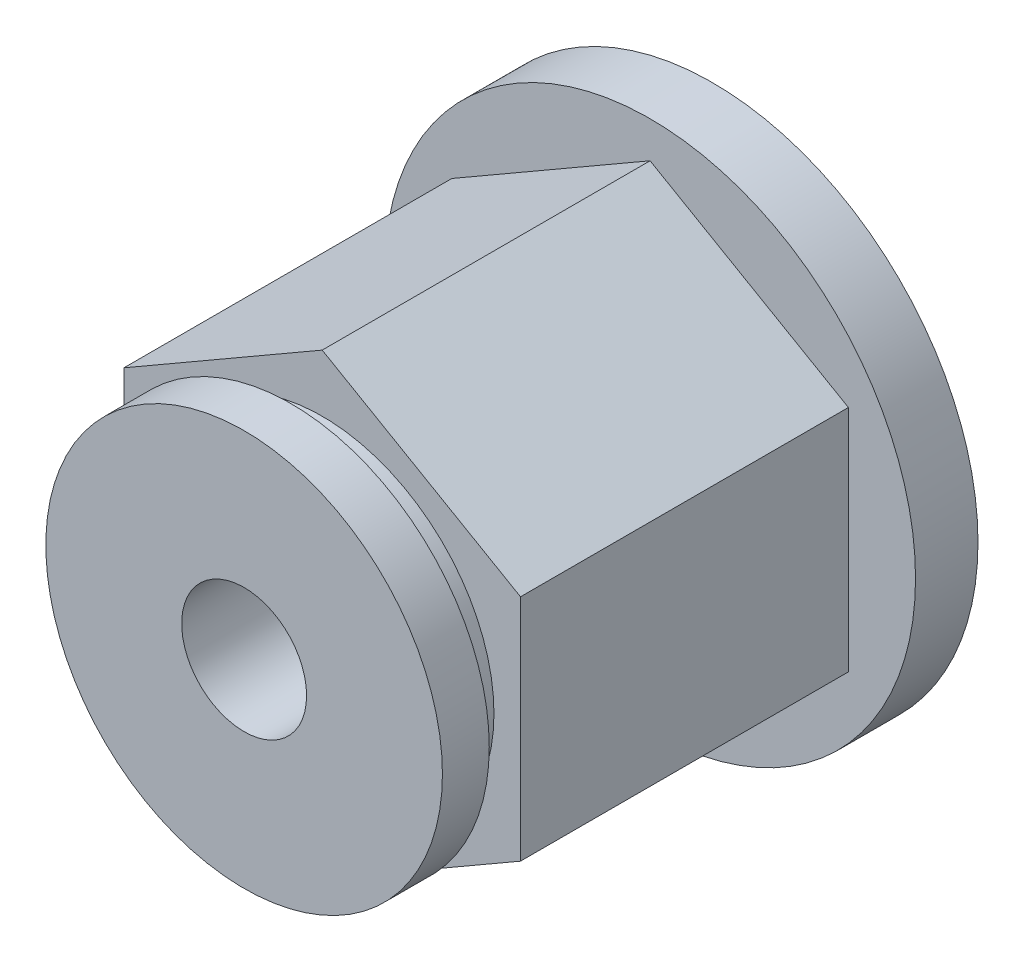
ISO-10303-21;
HEADER;
FILE_DESCRIPTION(('STEP AP214'),'2;1');
FILE_NAME('part.step','',(''),(''),'','','');
FILE_SCHEMA(('AUTOMOTIVE_DESIGN { 1 0 10303 214 1 1 1 1 }'));
ENDSEC;
DATA;
#1=APPLICATION_CONTEXT('core data for automotive mechanical design processes');
#2=APPLICATION_PROTOCOL_DEFINITION('international standard','automotive_design',2000,#1);
#3=PRODUCT_CONTEXT('',#1,'mechanical');
#4=PRODUCT('Part','Part','',(#3));
#5=PRODUCT_RELATED_PRODUCT_CATEGORY('part','',(#4));
#6=PRODUCT_DEFINITION_FORMATION('','',#4);
#7=PRODUCT_DEFINITION_CONTEXT('part definition',#1,'design');
#8=PRODUCT_DEFINITION('design','',#6,#7);
#9=PRODUCT_DEFINITION_SHAPE('','',#8);
#10=(LENGTH_UNIT() NAMED_UNIT(*) SI_UNIT(.MILLI.,.METRE.));
#11=(NAMED_UNIT(*) PLANE_ANGLE_UNIT() SI_UNIT($,.RADIAN.));
#12=(NAMED_UNIT(*) SI_UNIT($,.STERADIAN.) SOLID_ANGLE_UNIT());
#13=UNCERTAINTY_MEASURE_WITH_UNIT(LENGTH_MEASURE(1.E-05),#10,'distance_accuracy_value','');
#14=(GEOMETRIC_REPRESENTATION_CONTEXT(3) GLOBAL_UNCERTAINTY_ASSIGNED_CONTEXT((#13)) GLOBAL_UNIT_ASSIGNED_CONTEXT((#10,
#11,#12)) REPRESENTATION_CONTEXT('',''));
#15=CARTESIAN_POINT('',(0.,0.,0.));
#16=DIRECTION('',(0.,0.,1.));
#17=DIRECTION('',(1.,0.,0.));
#18=AXIS2_PLACEMENT_3D('',#15,#16,#17);
#19=CARTESIAN_POINT('',(6.35,-3.66617420935413,12.5));
#20=DIRECTION('',(0.,0.,1.));
#21=DIRECTION('',(1.,0.,0.));
#22=AXIS2_PLACEMENT_3D('',#19,#20,#21);
#23=PLANE('',#22);
#24=DIRECTION('',(0.866025403784439,0.5,0.));
#25=VECTOR('',#24,1.);
#26=CARTESIAN_POINT('',(0.,-7.33234841870825,12.5));
#27=LINE('',#26,#25);
#28=CARTESIAN_POINT('',(0.,-7.33234841870825,12.5));
#29=VERTEX_POINT('',#28);
#30=CARTESIAN_POINT('',(6.35,-3.66617420935413,12.5));
#31=VERTEX_POINT('',#30);
#32=EDGE_CURVE('E128',#29,#31,#27,.T.);
#33=ORIENTED_EDGE('',*,*,#32,.T.);
#34=DIRECTION('',(0.,1.,0.));
#35=VECTOR('',#34,1.);
#36=CARTESIAN_POINT('',(6.35,-3.66617420935413,12.5));
#37=LINE('',#36,#35);
#38=CARTESIAN_POINT('',(6.35,3.66617420935412,12.5));
#39=VERTEX_POINT('',#38);
#40=EDGE_CURVE('E83',#31,#39,#37,.T.);
#41=ORIENTED_EDGE('',*,*,#40,.T.);
#42=DIRECTION('',(-0.866025403784439,0.5,0.));
#43=VECTOR('',#42,1.);
#44=CARTESIAN_POINT('',(6.35,3.66617420935412,12.5));
#45=LINE('',#44,#43);
#46=CARTESIAN_POINT('',(0.,7.33234841870825,12.5));
#47=VERTEX_POINT('',#46);
#48=EDGE_CURVE('E96',#39,#47,#45,.T.);
#49=ORIENTED_EDGE('',*,*,#48,.T.);
#50=DIRECTION('',(-0.866025403784439,-0.5,0.));
#51=VECTOR('',#50,1.);
#52=CARTESIAN_POINT('',(0.,7.33234841870825,12.5));
#53=LINE('',#52,#51);
#54=CARTESIAN_POINT('',(-6.35,3.66617420935412,12.5));
#55=VERTEX_POINT('',#54);
#56=EDGE_CURVE('E90',#47,#55,#53,.T.);
#57=ORIENTED_EDGE('',*,*,#56,.T.);
#58=DIRECTION('',(0.,-1.,0.));
#59=VECTOR('',#58,1.);
#60=CARTESIAN_POINT('',(-6.35,3.66617420935412,12.5));
#61=LINE('',#60,#59);
#62=CARTESIAN_POINT('',(-6.35,-3.66617420935412,12.5));
#63=VERTEX_POINT('',#62);
#64=EDGE_CURVE('E94',#55,#63,#61,.T.);
#65=ORIENTED_EDGE('',*,*,#64,.T.);
#66=DIRECTION('',(0.866025403784438,-0.5,0.));
#67=VECTOR('',#66,1.);
#68=CARTESIAN_POINT('',(-6.35,-3.66617420935412,12.5));
#69=LINE('',#68,#67);
#70=EDGE_CURVE('E55',#63,#29,#69,.T.);
#71=ORIENTED_EDGE('',*,*,#70,.T.);
#72=EDGE_LOOP('',(#33,#41,#49,#57,#65,#71));
#73=FACE_BOUND('',#72,.T.);
#74=CARTESIAN_POINT('',(0.,0.,12.5));
#75=DIRECTION('',(0.,0.,1.));
#76=DIRECTION('',(1.,0.,0.));
#77=AXIS2_PLACEMENT_3D('',#74,#75,#76);
#78=CIRCLE('',#77,5.5);
#79=CARTESIAN_POINT('',(5.5,0.,12.5));
#80=VERTEX_POINT('',#79);
#81=EDGE_CURVE('E188',#80,#80,#78,.T.);
#82=ORIENTED_EDGE('',*,*,#81,.F.);
#83=EDGE_LOOP('',(#82));
#84=FACE_BOUND('',#83,.T.);
#85=ADVANCED_FACE('F32',(#73,#84),#23,.T.);
#86=CARTESIAN_POINT('',(0.,0.,2.));
#87=DIRECTION('',(0.,0.,1.));
#88=DIRECTION('',(1.,0.,0.));
#89=AXIS2_PLACEMENT_3D('',#86,#87,#88);
#90=PLANE('',#89);
#91=CARTESIAN_POINT('',(0.,0.,2.));
#92=DIRECTION('',(0.,0.,1.));
#93=DIRECTION('',(1.,0.,0.));
#94=AXIS2_PLACEMENT_3D('',#91,#92,#93);
#95=CIRCLE('',#94,8.5);
#96=CARTESIAN_POINT('',(8.5,0.,2.));
#97=VERTEX_POINT('',#96);
#98=EDGE_CURVE('E11',#97,#97,#95,.T.);
#99=ORIENTED_EDGE('',*,*,#98,.T.);
#100=EDGE_LOOP('',(#99));
#101=FACE_BOUND('',#100,.T.);
#102=DIRECTION('',(0.,1.,0.));
#103=VECTOR('',#102,1.);
#104=CARTESIAN_POINT('',(6.35,-3.66617420935413,2.));
#105=LINE('',#104,#103);
#106=CARTESIAN_POINT('',(6.35,-3.66617420935413,2.));
#107=VERTEX_POINT('',#106);
#108=CARTESIAN_POINT('',(6.35,3.66617420935412,2.));
#109=VERTEX_POINT('',#108);
#110=EDGE_CURVE('E119',#107,#109,#105,.T.);
#111=ORIENTED_EDGE('',*,*,#110,.F.);
#112=DIRECTION('',(0.866025403784439,0.5,0.));
#113=VECTOR('',#112,1.);
#114=CARTESIAN_POINT('',(0.,-7.33234841870825,2.));
#115=LINE('',#114,#113);
#116=CARTESIAN_POINT('',(0.,-7.33234841870825,2.));
#117=VERTEX_POINT('',#116);
#118=EDGE_CURVE('E116',#117,#107,#115,.T.);
#119=ORIENTED_EDGE('',*,*,#118,.F.);
#120=DIRECTION('',(0.866025403784438,-0.5,0.));
#121=VECTOR('',#120,1.);
#122=CARTESIAN_POINT('',(-6.35,-3.66617420935412,2.));
#123=LINE('',#122,#121);
#124=CARTESIAN_POINT('',(-6.35,-3.66617420935412,2.));
#125=VERTEX_POINT('',#124);
#126=EDGE_CURVE('E75',#125,#117,#123,.T.);
#127=ORIENTED_EDGE('',*,*,#126,.F.);
#128=DIRECTION('',(0.,-1.,0.));
#129=VECTOR('',#128,1.);
#130=CARTESIAN_POINT('',(-6.35,3.66617420935412,2.));
#131=LINE('',#130,#129);
#132=CARTESIAN_POINT('',(-6.35,3.66617420935412,2.));
#133=VERTEX_POINT('',#132);
#134=EDGE_CURVE('E125',#133,#125,#131,.T.);
#135=ORIENTED_EDGE('',*,*,#134,.F.);
#136=DIRECTION('',(-0.866025403784439,-0.5,0.));
#137=VECTOR('',#136,1.);
#138=CARTESIAN_POINT('',(0.,7.33234841870825,2.));
#139=LINE('',#138,#137);
#140=CARTESIAN_POINT('',(0.,7.33234841870825,2.));
#141=VERTEX_POINT('',#140);
#142=EDGE_CURVE('E105',#141,#133,#139,.T.);
#143=ORIENTED_EDGE('',*,*,#142,.F.);
#144=DIRECTION('',(-0.866025403784439,0.5,0.));
#145=VECTOR('',#144,1.);
#146=CARTESIAN_POINT('',(6.35,3.66617420935412,2.));
#147=LINE('',#146,#145);
#148=EDGE_CURVE('E122',#109,#141,#147,.T.);
#149=ORIENTED_EDGE('',*,*,#148,.F.);
#150=EDGE_LOOP('',(#111,#119,#127,#135,#143,#149));
#151=FACE_BOUND('',#150,.T.);
#152=ADVANCED_FACE('F152',(#101,#151),#90,.T.);
#153=CARTESIAN_POINT('',(0.,0.,2.));
#154=DIRECTION('',(0.,0.,-1.));
#155=DIRECTION('',(-1.,0.,0.));
#156=AXIS2_PLACEMENT_3D('',#153,#154,#155);
#157=CYLINDRICAL_SURFACE('',#156,8.5);
#158=ORIENTED_EDGE('',*,*,#98,.F.);
#159=EDGE_LOOP('',(#158));
#160=FACE_BOUND('',#159,.T.);
#161=CARTESIAN_POINT('',(0.,0.,0.));
#162=DIRECTION('',(0.,0.,1.));
#163=DIRECTION('',(1.,0.,0.));
#164=AXIS2_PLACEMENT_3D('',#161,#162,#163);
#165=CIRCLE('',#164,8.5);
#166=CARTESIAN_POINT('',(8.5,0.,0.));
#167=VERTEX_POINT('',#166);
#168=EDGE_CURVE('E36',#167,#167,#165,.T.);
#169=ORIENTED_EDGE('',*,*,#168,.T.);
#170=EDGE_LOOP('',(#169));
#171=FACE_BOUND('',#170,.T.);
#172=ADVANCED_FACE('F34',(#160,#171),#157,.T.);
#173=CARTESIAN_POINT('',(0.,0.,0.));
#174=DIRECTION('',(0.,0.,1.));
#175=DIRECTION('',(1.,0.,0.));
#176=AXIS2_PLACEMENT_3D('',#173,#174,#175);
#177=PLANE('',#176);
#178=CARTESIAN_POINT('',(0.,0.,0.));
#179=DIRECTION('',(0.,0.,1.));
#180=DIRECTION('',(1.,0.,0.));
#181=AXIS2_PLACEMENT_3D('',#178,#179,#180);
#182=CIRCLE('',#181,2.);
#183=CARTESIAN_POINT('',(2.,0.,0.));
#184=VERTEX_POINT('',#183);
#185=EDGE_CURVE('E197',#184,#184,#182,.T.);
#186=ORIENTED_EDGE('',*,*,#185,.T.);
#187=EDGE_LOOP('',(#186));
#188=FACE_BOUND('',#187,.T.);
#189=ORIENTED_EDGE('',*,*,#168,.F.);
#190=EDGE_LOOP('',(#189));
#191=FACE_BOUND('',#190,.T.);
#192=ADVANCED_FACE('F141',(#188,#191),#177,.F.);
#193=CARTESIAN_POINT('',(0.,-7.33234841870825,12.5));
#194=DIRECTION('',(-0.5,0.866025403784439,0.));
#195=DIRECTION('',(-0.866025403784439,-0.5,0.));
#196=AXIS2_PLACEMENT_3D('',#193,#194,#195);
#197=PLANE('',#196);
#198=ORIENTED_EDGE('',*,*,#118,.T.);
#199=DIRECTION('',(0.,0.,-1.));
#200=VECTOR('',#199,1.);
#201=CARTESIAN_POINT('',(6.35,-3.66617420935413,12.5));
#202=LINE('',#201,#200);
#203=EDGE_CURVE('E135',#31,#107,#202,.T.);
#204=ORIENTED_EDGE('',*,*,#203,.F.);
#205=ORIENTED_EDGE('',*,*,#32,.F.);
#206=DIRECTION('',(0.,0.,-1.));
#207=VECTOR('',#206,1.);
#208=CARTESIAN_POINT('',(0.,-7.33234841870825,12.5));
#209=LINE('',#208,#207);
#210=EDGE_CURVE('E112',#29,#117,#209,.T.);
#211=ORIENTED_EDGE('',*,*,#210,.T.);
#212=EDGE_LOOP('',(#198,#204,#205,#211));
#213=FACE_BOUND('',#212,.T.);
#214=ADVANCED_FACE('F143',(#213),#197,.F.);
#215=CARTESIAN_POINT('',(6.35,-3.66617420935413,12.5));
#216=DIRECTION('',(-1.,0.,0.));
#217=DIRECTION('',(0.,0.,1.));
#218=AXIS2_PLACEMENT_3D('',#215,#216,#217);
#219=PLANE('',#218);
#220=ORIENTED_EDGE('',*,*,#110,.T.);
#221=DIRECTION('',(0.,0.,-1.));
#222=VECTOR('',#221,1.);
#223=CARTESIAN_POINT('',(6.35,3.66617420935412,12.5));
#224=LINE('',#223,#222);
#225=EDGE_CURVE('E132',#39,#109,#224,.T.);
#226=ORIENTED_EDGE('',*,*,#225,.F.);
#227=ORIENTED_EDGE('',*,*,#40,.F.);
#228=ORIENTED_EDGE('',*,*,#203,.T.);
#229=EDGE_LOOP('',(#220,#226,#227,#228));
#230=FACE_BOUND('',#229,.T.);
#231=ADVANCED_FACE('F149',(#230),#219,.F.);
#232=CARTESIAN_POINT('',(6.35,3.66617420935412,12.5));
#233=DIRECTION('',(-0.5,-0.866025403784439,0.));
#234=DIRECTION('',(0.866025403784439,-0.5,0.));
#235=AXIS2_PLACEMENT_3D('',#232,#233,#234);
#236=PLANE('',#235);
#237=ORIENTED_EDGE('',*,*,#148,.T.);
#238=DIRECTION('',(0.,0.,-1.));
#239=VECTOR('',#238,1.);
#240=CARTESIAN_POINT('',(0.,7.33234841870825,12.5));
#241=LINE('',#240,#239);
#242=EDGE_CURVE('E108',#47,#141,#241,.T.);
#243=ORIENTED_EDGE('',*,*,#242,.F.);
#244=ORIENTED_EDGE('',*,*,#48,.F.);
#245=ORIENTED_EDGE('',*,*,#225,.T.);
#246=EDGE_LOOP('',(#237,#243,#244,#245));
#247=FACE_BOUND('',#246,.T.);
#248=ADVANCED_FACE('F173',(#247),#236,.F.);
#249=CARTESIAN_POINT('',(0.,7.33234841870825,12.5));
#250=DIRECTION('',(0.5,-0.866025403784439,0.));
#251=DIRECTION('',(0.866025403784439,0.5,0.));
#252=AXIS2_PLACEMENT_3D('',#249,#250,#251);
#253=PLANE('',#252);
#254=ORIENTED_EDGE('',*,*,#142,.T.);
#255=DIRECTION('',(0.,0.,-1.));
#256=VECTOR('',#255,1.);
#257=CARTESIAN_POINT('',(-6.35,3.66617420935412,12.5));
#258=LINE('',#257,#256);
#259=EDGE_CURVE('E102',#55,#133,#258,.T.);
#260=ORIENTED_EDGE('',*,*,#259,.F.);
#261=ORIENTED_EDGE('',*,*,#56,.F.);
#262=ORIENTED_EDGE('',*,*,#242,.T.);
#263=EDGE_LOOP('',(#254,#260,#261,#262));
#264=FACE_BOUND('',#263,.T.);
#265=ADVANCED_FACE('F103',(#264),#253,.F.);
#266=CARTESIAN_POINT('',(-6.35,3.66617420935412,12.5));
#267=DIRECTION('',(1.,0.,0.));
#268=DIRECTION('',(0.,0.,-1.));
#269=AXIS2_PLACEMENT_3D('',#266,#267,#268);
#270=PLANE('',#269);
#271=ORIENTED_EDGE('',*,*,#134,.T.);
#272=DIRECTION('',(0.,0.,-1.));
#273=VECTOR('',#272,1.);
#274=CARTESIAN_POINT('',(-6.35,-3.66617420935412,12.5));
#275=LINE('',#274,#273);
#276=EDGE_CURVE('E47',#63,#125,#275,.T.);
#277=ORIENTED_EDGE('',*,*,#276,.F.);
#278=ORIENTED_EDGE('',*,*,#64,.F.);
#279=ORIENTED_EDGE('',*,*,#259,.T.);
#280=EDGE_LOOP('',(#271,#277,#278,#279));
#281=FACE_BOUND('',#280,.T.);
#282=ADVANCED_FACE('F110',(#281),#270,.F.);
#283=CARTESIAN_POINT('',(-6.35,-3.66617420935412,12.5));
#284=DIRECTION('',(0.5,0.866025403784439,0.));
#285=DIRECTION('',(-0.866025403784438,0.5,0.));
#286=AXIS2_PLACEMENT_3D('',#283,#284,#285);
#287=PLANE('',#286);
#288=ORIENTED_EDGE('',*,*,#126,.T.);
#289=ORIENTED_EDGE('',*,*,#210,.F.);
#290=ORIENTED_EDGE('',*,*,#70,.F.);
#291=ORIENTED_EDGE('',*,*,#276,.T.);
#292=EDGE_LOOP('',(#288,#289,#290,#291));
#293=FACE_BOUND('',#292,.T.);
#294=ADVANCED_FACE('F166',(#293),#287,.F.);
#295=CARTESIAN_POINT('',(0.,0.,13.5));
#296=DIRECTION('',(0.,0.,-1.));
#297=DIRECTION('',(-1.,0.,0.));
#298=AXIS2_PLACEMENT_3D('',#295,#296,#297);
#299=CYLINDRICAL_SURFACE('',#298,5.5);
#300=CARTESIAN_POINT('',(0.,0.,13.5));
#301=DIRECTION('',(0.,0.,1.));
#302=DIRECTION('',(1.,0.,0.));
#303=AXIS2_PLACEMENT_3D('',#300,#301,#302);
#304=CIRCLE('',#303,5.5);
#305=CARTESIAN_POINT('',(5.5,0.,13.5));
#306=VERTEX_POINT('',#305);
#307=EDGE_CURVE('E120',#306,#306,#304,.T.);
#308=ORIENTED_EDGE('',*,*,#307,.F.);
#309=EDGE_LOOP('',(#308));
#310=FACE_BOUND('',#309,.T.);
#311=ORIENTED_EDGE('',*,*,#81,.T.);
#312=EDGE_LOOP('',(#311));
#313=FACE_BOUND('',#312,.T.);
#314=ADVANCED_FACE('F164',(#310,#313),#299,.T.);
#315=CARTESIAN_POINT('',(0.,0.,13.5));
#316=DIRECTION('',(0.,0.,1.));
#317=DIRECTION('',(1.,0.,0.));
#318=AXIS2_PLACEMENT_3D('',#315,#316,#317);
#319=PLANE('',#318);
#320=CARTESIAN_POINT('',(0.,0.,13.5));
#321=DIRECTION('',(0.,0.,1.));
#322=DIRECTION('',(1.,0.,0.));
#323=AXIS2_PLACEMENT_3D('',#320,#321,#322);
#324=CIRCLE('',#323,6.35);
#325=CARTESIAN_POINT('',(6.35,0.,13.5));
#326=VERTEX_POINT('',#325);
#327=EDGE_CURVE('E194',#326,#326,#324,.T.);
#328=ORIENTED_EDGE('',*,*,#327,.F.);
#329=EDGE_LOOP('',(#328));
#330=FACE_BOUND('',#329,.T.);
#331=ORIENTED_EDGE('',*,*,#307,.T.);
#332=EDGE_LOOP('',(#331));
#333=FACE_BOUND('',#332,.T.);
#334=ADVANCED_FACE('F220',(#330,#333),#319,.F.);
#335=CARTESIAN_POINT('',(0.,0.,15.));
#336=DIRECTION('',(0.,0.,-1.));
#337=DIRECTION('',(-1.,0.,0.));
#338=AXIS2_PLACEMENT_3D('',#335,#336,#337);
#339=CYLINDRICAL_SURFACE('',#338,6.35);
#340=CARTESIAN_POINT('',(0.,0.,15.));
#341=DIRECTION('',(0.,0.,1.));
#342=DIRECTION('',(1.,0.,0.));
#343=AXIS2_PLACEMENT_3D('',#340,#341,#342);
#344=CIRCLE('',#343,6.35);
#345=CARTESIAN_POINT('',(6.35,0.,15.));
#346=VERTEX_POINT('',#345);
#347=EDGE_CURVE('E191',#346,#346,#344,.T.);
#348=ORIENTED_EDGE('',*,*,#347,.F.);
#349=EDGE_LOOP('',(#348));
#350=FACE_BOUND('',#349,.T.);
#351=ORIENTED_EDGE('',*,*,#327,.T.);
#352=EDGE_LOOP('',(#351));
#353=FACE_BOUND('',#352,.T.);
#354=ADVANCED_FACE('F214',(#350,#353),#339,.T.);
#355=CARTESIAN_POINT('',(0.,0.,15.));
#356=DIRECTION('',(0.,0.,1.));
#357=DIRECTION('',(1.,0.,0.));
#358=AXIS2_PLACEMENT_3D('',#355,#356,#357);
#359=PLANE('',#358);
#360=CARTESIAN_POINT('',(0.,0.,15.));
#361=DIRECTION('',(0.,0.,1.));
#362=DIRECTION('',(1.,0.,0.));
#363=AXIS2_PLACEMENT_3D('',#360,#361,#362);
#364=CIRCLE('',#363,2.);
#365=CARTESIAN_POINT('',(2.,0.,15.));
#366=VERTEX_POINT('',#365);
#367=EDGE_CURVE('E200',#366,#366,#364,.T.);
#368=ORIENTED_EDGE('',*,*,#367,.F.);
#369=EDGE_LOOP('',(#368));
#370=FACE_BOUND('',#369,.T.);
#371=ORIENTED_EDGE('',*,*,#347,.T.);
#372=EDGE_LOOP('',(#371));
#373=FACE_BOUND('',#372,.T.);
#374=ADVANCED_FACE('F208',(#370,#373),#359,.T.);
#375=CARTESIAN_POINT('',(0.,0.,0.));
#376=DIRECTION('',(0.,0.,1.));
#377=DIRECTION('',(1.,0.,0.));
#378=AXIS2_PLACEMENT_3D('',#375,#376,#377);
#379=CYLINDRICAL_SURFACE('',#378,2.);
#380=CARTESIAN_POINT('',(2.,0.,0.));
#381=CARTESIAN_POINT('',(2.,0.,0.15625));
#382=CARTESIAN_POINT('',(2.,0.,0.3125));
#383=CARTESIAN_POINT('',(2.,0.,0.625));
#384=CARTESIAN_POINT('',(2.,0.,0.78125));
#385=CARTESIAN_POINT('',(2.,0.,1.09375));
#386=CARTESIAN_POINT('',(2.,0.,1.25));
#387=CARTESIAN_POINT('',(2.,0.,1.5625));
#388=CARTESIAN_POINT('',(2.,0.,1.71875));
#389=CARTESIAN_POINT('',(2.,0.,2.03125));
#390=CARTESIAN_POINT('',(2.,0.,2.1875));
#391=CARTESIAN_POINT('',(2.,0.,2.5));
#392=CARTESIAN_POINT('',(2.,0.,2.65625));
#393=CARTESIAN_POINT('',(2.,0.,2.96875));
#394=CARTESIAN_POINT('',(2.,0.,3.125));
#395=CARTESIAN_POINT('',(2.,0.,3.4375));
#396=CARTESIAN_POINT('',(2.,0.,3.59375));
#397=CARTESIAN_POINT('',(2.,0.,3.90625));
#398=CARTESIAN_POINT('',(2.,0.,4.0625));
#399=CARTESIAN_POINT('',(2.,0.,4.375));
#400=CARTESIAN_POINT('',(2.,0.,4.53125));
#401=CARTESIAN_POINT('',(2.,0.,4.84375));
#402=CARTESIAN_POINT('',(2.,0.,5.));
#403=CARTESIAN_POINT('',(2.,0.,5.3125));
#404=CARTESIAN_POINT('',(2.,0.,5.46875));
#405=CARTESIAN_POINT('',(2.,0.,5.78125));
#406=CARTESIAN_POINT('',(2.,0.,5.9375));
#407=CARTESIAN_POINT('',(2.,0.,6.25));
#408=CARTESIAN_POINT('',(2.,0.,6.40625));
#409=CARTESIAN_POINT('',(2.,0.,6.71875));
#410=CARTESIAN_POINT('',(2.,0.,6.875));
#411=CARTESIAN_POINT('',(2.,0.,7.1875));
#412=CARTESIAN_POINT('',(2.,0.,7.34375));
#413=CARTESIAN_POINT('',(2.,0.,7.65625));
#414=CARTESIAN_POINT('',(2.,0.,7.8125));
#415=CARTESIAN_POINT('',(2.,0.,8.125));
#416=CARTESIAN_POINT('',(2.,0.,8.28125));
#417=CARTESIAN_POINT('',(2.,0.,8.59375));
#418=CARTESIAN_POINT('',(2.,0.,8.75));
#419=CARTESIAN_POINT('',(2.,0.,9.0625));
#420=CARTESIAN_POINT('',(2.,0.,9.21875));
#421=CARTESIAN_POINT('',(2.,0.,9.53125));
#422=CARTESIAN_POINT('',(2.,0.,9.6875));
#423=CARTESIAN_POINT('',(2.,0.,10.));
#424=CARTESIAN_POINT('',(2.,0.,10.15625));
#425=CARTESIAN_POINT('',(2.,0.,10.46875));
#426=CARTESIAN_POINT('',(2.,0.,10.625));
#427=CARTESIAN_POINT('',(2.,0.,10.9375));
#428=CARTESIAN_POINT('',(2.,0.,11.09375));
#429=CARTESIAN_POINT('',(2.,0.,11.40625));
#430=CARTESIAN_POINT('',(2.,0.,11.5625));
#431=CARTESIAN_POINT('',(2.,0.,11.875));
#432=CARTESIAN_POINT('',(2.,0.,12.03125));
#433=CARTESIAN_POINT('',(2.,0.,12.34375));
#434=CARTESIAN_POINT('',(2.,0.,12.5));
#435=CARTESIAN_POINT('',(2.,0.,12.8125));
#436=CARTESIAN_POINT('',(2.,0.,12.96875));
#437=CARTESIAN_POINT('',(2.,0.,13.28125));
#438=CARTESIAN_POINT('',(2.,0.,13.4375));
#439=CARTESIAN_POINT('',(2.,0.,13.75));
#440=CARTESIAN_POINT('',(2.,0.,13.90625));
#441=CARTESIAN_POINT('',(2.,0.,14.21875));
#442=CARTESIAN_POINT('',(2.,0.,14.375));
#443=CARTESIAN_POINT('',(2.,0.,14.6875));
#444=CARTESIAN_POINT('',(2.,0.,14.84375));
#445=CARTESIAN_POINT('',(2.,0.,15.));
#446=B_SPLINE_CURVE_WITH_KNOTS('',3,(#380,#381,#382,#383,#384,#385,#386,#387,#388,#389,#390,
#391,#392,#393,#394,#395,#396,#397,#398,#399,#400,#401,#402,#403,#404,#405,#406,#407,#408,#409,
#410,#411,#412,#413,#414,#415,#416,#417,#418,#419,#420,#421,#422,#423,#424,#425,#426,#427,#428,
#429,#430,#431,#432,#433,#434,#435,#436,#437,#438,#439,#440,#441,#442,#443,#444,#445),
.UNSPECIFIED.,.F.,.F.,(4,2,2,2,2,2,2,2,2,2,2,2,2,2,2,2,2,2,2,2,2,2,2,2,2,2,2,2,2,2,2,2,4),(0.,
0.46875,0.9375,1.40625,1.875,2.34375,2.8125,3.28125,3.75,4.21875,4.6875,5.15625,5.625,6.09375,
6.5625,7.03125,7.5,7.96875,8.4375,8.90625,9.375,9.84375,10.3125,10.78125,11.25,11.71875,12.1875,
12.65625,13.125,13.59375,14.0625,14.53125,15.),.UNSPECIFIED.);
#447=EDGE_CURVE('BSEAM205',#184,#366,#446,.T.);
#448=ORIENTED_EDGE('',*,*,#185,.F.);
#449=ORIENTED_EDGE('',*,*,#367,.T.);
#450=ORIENTED_EDGE('',*,*,#447,.T.);
#451=ORIENTED_EDGE('',*,*,#447,.F.);
#452=EDGE_LOOP('',(#448,#450,#449,#451));
#453=FACE_BOUND('',#452,.T.);
#454=ADVANCED_FACE('F205',(#453),#379,.F.);
#455=CLOSED_SHELL('',(#85,#152,#172,#192,#214,#231,#248,#265,#282,#294,#314,#334,#354,#374,#454));
#456=MANIFOLD_SOLID_BREP('B2',#455);
#457=ADVANCED_BREP_SHAPE_REPRESENTATION('',(#18,#456),#14);
#458=SHAPE_DEFINITION_REPRESENTATION(#9,#457);
ENDSEC;
END-ISO-10303-21;
